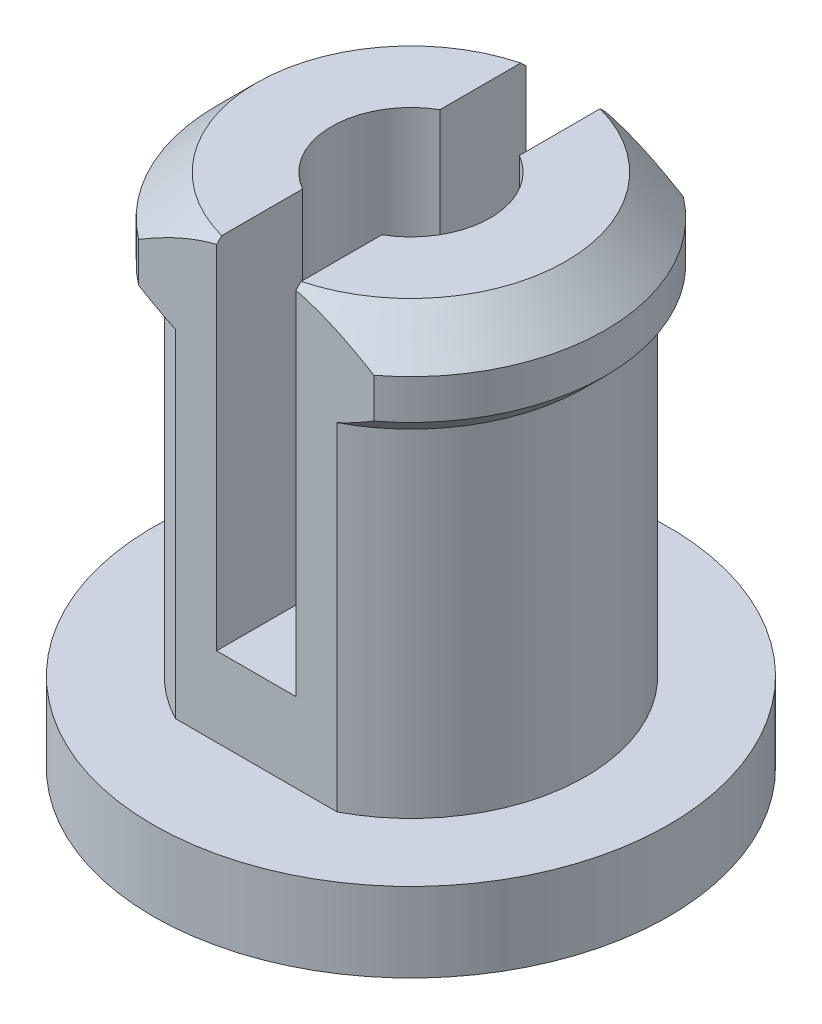
ISO-10303-21;
HEADER;
FILE_DESCRIPTION(('STEP AP214'),'2;1');
FILE_NAME('part.step','',(''),(''),'','','');
FILE_SCHEMA(('AUTOMOTIVE_DESIGN { 1 0 10303 214 1 1 1 1 }'));
ENDSEC;
DATA;
#1=APPLICATION_CONTEXT('core data for automotive mechanical design processes');
#2=APPLICATION_PROTOCOL_DEFINITION('international standard','automotive_design',2000,#1);
#3=PRODUCT_CONTEXT('',#1,'mechanical');
#4=PRODUCT('Part','Part','',(#3));
#5=PRODUCT_RELATED_PRODUCT_CATEGORY('part','',(#4));
#6=PRODUCT_DEFINITION_FORMATION('','',#4);
#7=PRODUCT_DEFINITION_CONTEXT('part definition',#1,'design');
#8=PRODUCT_DEFINITION('design','',#6,#7);
#9=PRODUCT_DEFINITION_SHAPE('','',#8);
#10=(LENGTH_UNIT() NAMED_UNIT(*) SI_UNIT(.MILLI.,.METRE.));
#11=(NAMED_UNIT(*) PLANE_ANGLE_UNIT() SI_UNIT($,.RADIAN.));
#12=(NAMED_UNIT(*) SI_UNIT($,.STERADIAN.) SOLID_ANGLE_UNIT());
#13=UNCERTAINTY_MEASURE_WITH_UNIT(LENGTH_MEASURE(1.E-05),#10,'distance_accuracy_value','');
#14=(GEOMETRIC_REPRESENTATION_CONTEXT(3) GLOBAL_UNCERTAINTY_ASSIGNED_CONTEXT((#13)) GLOBAL_UNIT_ASSIGNED_CONTEXT((#10,
#11,#12)) REPRESENTATION_CONTEXT('',''));
#15=CARTESIAN_POINT('',(0.,0.,0.));
#16=DIRECTION('',(0.,0.,1.));
#17=DIRECTION('',(1.,0.,0.));
#18=AXIS2_PLACEMENT_3D('',#15,#16,#17);
#19=CARTESIAN_POINT('',(0.,11.,0.));
#20=DIRECTION('',(0.,1.,0.));
#21=DIRECTION('',(0.,0.,1.));
#22=AXIS2_PLACEMENT_3D('',#19,#20,#21);
#23=PLANE('',#22);
#24=DIRECTION('',(0.,0.,1.));
#25=VECTOR('',#24,1.);
#26=CARTESIAN_POINT('',(1.,11.,0.));
#27=LINE('',#26,#25);
#28=CARTESIAN_POINT('',(1.,11.,1.73205080756888));
#29=VERTEX_POINT('',#28);
#30=CARTESIAN_POINT('',(1.,11.,3.76961536499416));
#31=VERTEX_POINT('',#30);
#32=EDGE_CURVE('E294',#29,#31,#27,.T.);
#33=ORIENTED_EDGE('',*,*,#32,.T.);
#34=CARTESIAN_POINT('',(0.,11.,0.));
#35=DIRECTION('',(0.,1.,0.));
#36=DIRECTION('',(0.,0.,1.));
#37=AXIS2_PLACEMENT_3D('',#34,#35,#36);
#38=CIRCLE('',#37,3.9);
#39=CARTESIAN_POINT('',(1.,11.,-3.76961536499416));
#40=VERTEX_POINT('',#39);
#41=EDGE_CURVE('E199',#31,#40,#38,.T.);
#42=ORIENTED_EDGE('',*,*,#41,.T.);
#43=DIRECTION('',(0.,0.,1.));
#44=VECTOR('',#43,1.);
#45=CARTESIAN_POINT('',(1.,11.,0.));
#46=LINE('',#45,#44);
#47=CARTESIAN_POINT('',(1.,11.,-1.73205080756888));
#48=VERTEX_POINT('',#47);
#49=EDGE_CURVE('E138',#40,#48,#46,.T.);
#50=ORIENTED_EDGE('',*,*,#49,.T.);
#51=CARTESIAN_POINT('',(0.,11.,0.));
#52=DIRECTION('',(0.,1.,0.));
#53=DIRECTION('',(0.,0.,1.));
#54=AXIS2_PLACEMENT_3D('',#51,#52,#53);
#55=CIRCLE('',#54,2.);
#56=EDGE_CURVE('E299',#29,#48,#55,.T.);
#57=ORIENTED_EDGE('',*,*,#56,.F.);
#58=EDGE_LOOP('',(#33,#42,#50,#57));
#59=FACE_BOUND('',#58,.T.);
#60=ADVANCED_FACE('F45',(#59),#23,.T.);
#61=CARTESIAN_POINT('',(0.,-6.01664358259654,3.9));
#62=DIRECTION('',(0.,0.,1.));
#63=DIRECTION('',(1.,0.,0.));
#64=AXIS2_PLACEMENT_3D('',#61,#62,#63);
#65=PLANE('',#64);
#66=CARTESIAN_POINT('',(-2.96647939483827,9.00000000000002,3.9));
#67=CARTESIAN_POINT('',(-2.89118910821412,8.95442569472736,3.9));
#68=CARTESIAN_POINT('',(-2.81541232557426,8.90964276426273,3.9));
#69=CARTESIAN_POINT('',(-2.66285574367853,8.82195841606904,3.9));
#70=CARTESIAN_POINT('',(-2.5860767502808,8.77905559458639,3.9));
#71=CARTESIAN_POINT('',(-2.43136156920744,8.69535475268988,3.9));
#72=CARTESIAN_POINT('',(-2.35342523312827,8.65455700525932,3.9));
#73=CARTESIAN_POINT('',(-2.19626365456138,8.57537483267373,3.9));
#74=CARTESIAN_POINT('',(-2.11703747641008,8.53699226755765,3.9));
#75=CARTESIAN_POINT('',(-2.03715487874633,8.50000000000001,3.9));
#76=B_SPLINE_CURVE_WITH_KNOTS('',3,(#66,#67,#68,#69,#70,#71,#72,#73,#74,#75),.UNSPECIFIED.,.F.,
.F.,(4,2,2,2,4),(0.,0.264032287984153,0.527863959398481,0.791729758618769,1.05579634626755),.UNSPECIFIED.);
#77=CARTESIAN_POINT('',(-2.96647939483827,9.00000000000002,3.9));
#78=VERTEX_POINT('',#77);
#79=CARTESIAN_POINT('',(-2.03715487874633,8.50000000000001,3.9));
#80=VERTEX_POINT('',#79);
#81=EDGE_CURVE('E240',#78,#80,#76,.T.);
#82=ORIENTED_EDGE('',*,*,#81,.T.);
#83=DIRECTION('',(0.,-1.,0.));
#84=VECTOR('',#83,1.);
#85=CARTESIAN_POINT('',(-2.03715487874633,8.,3.9));
#86=LINE('',#85,#84);
#87=CARTESIAN_POINT('',(-2.03715487874633,0.,3.9));
#88=VERTEX_POINT('',#87);
#89=EDGE_CURVE('E78',#80,#88,#86,.T.);
#90=ORIENTED_EDGE('',*,*,#89,.T.);
#91=DIRECTION('',(-1.,0.,0.));
#92=VECTOR('',#91,1.);
#93=CARTESIAN_POINT('',(0.,0.,3.9));
#94=LINE('',#93,#92);
#95=CARTESIAN_POINT('',(2.03715487874633,0.,3.9));
#96=VERTEX_POINT('',#95);
#97=EDGE_CURVE('E319',#96,#88,#94,.T.);
#98=ORIENTED_EDGE('',*,*,#97,.F.);
#99=DIRECTION('',(0.,-1.,0.));
#100=VECTOR('',#99,1.);
#101=CARTESIAN_POINT('',(2.03715487874633,8.,3.9));
#102=LINE('',#101,#100);
#103=CARTESIAN_POINT('',(2.03715487874633,8.50000000000001,3.9));
#104=VERTEX_POINT('',#103);
#105=EDGE_CURVE('E90',#96,#104,#102,.F.);
#106=ORIENTED_EDGE('',*,*,#105,.T.);
#107=CARTESIAN_POINT('',(2.03715487874633,8.50000000000001,3.9));
#108=CARTESIAN_POINT('',(2.11703747641008,8.53699226755765,3.9));
#109=CARTESIAN_POINT('',(2.19626365456138,8.57537483267373,3.9));
#110=CARTESIAN_POINT('',(2.35342523312827,8.65455700525932,3.9));
#111=CARTESIAN_POINT('',(2.43136156920744,8.69535475268988,3.9));
#112=CARTESIAN_POINT('',(2.5860767502808,8.77905559458639,3.9));
#113=CARTESIAN_POINT('',(2.66285574367853,8.82195841606904,3.9));
#114=CARTESIAN_POINT('',(2.81541232557426,8.90964276426273,3.9));
#115=CARTESIAN_POINT('',(2.89118910821412,8.95442569472736,3.9));
#116=CARTESIAN_POINT('',(2.96647939483827,9.00000000000002,3.9));
#117=B_SPLINE_CURVE_WITH_KNOTS('',3,(#107,#108,#109,#110,#111,#112,#113,#114,#115,#116),
.UNSPECIFIED.,.F.,.F.,(4,2,2,2,4),(0.,0.264066587648786,0.527932386869073,0.791764058283402,
1.05579634626755),.UNSPECIFIED.);
#118=CARTESIAN_POINT('',(2.96647939483827,9.00000000000002,3.9));
#119=VERTEX_POINT('',#118);
#120=EDGE_CURVE('E228',#104,#119,#117,.T.);
#121=ORIENTED_EDGE('',*,*,#120,.T.);
#122=DIRECTION('',(0.,1.,0.));
#123=VECTOR('',#122,1.);
#124=CARTESIAN_POINT('',(2.96647939483827,-6.01664358259654,3.9));
#125=LINE('',#124,#123);
#126=CARTESIAN_POINT('',(2.96647939483827,9.99999999999999,3.9));
#127=VERTEX_POINT('',#126);
#128=EDGE_CURVE('E313',#119,#127,#125,.T.);
#129=ORIENTED_EDGE('',*,*,#128,.T.);
#130=CARTESIAN_POINT('',(2.96647939483827,9.99999999999999,3.9));
#131=CARTESIAN_POINT('',(2.88936505497642,10.0466793445833,3.9));
#132=CARTESIAN_POINT('',(2.81174380725965,10.0925250390421,3.9));
#133=CARTESIAN_POINT('',(2.65536847672463,10.1822811719095,3.9));
#134=CARTESIAN_POINT('',(2.57661414244571,10.2261911716695,3.9));
#135=CARTESIAN_POINT('',(2.33942832354997,10.3540974764555,3.9));
#136=CARTESIAN_POINT('',(2.17919869577028,10.4348074890939,3.9));
#137=CARTESIAN_POINT('',(1.85293386105664,10.5846405415535,3.9));
#138=CARTESIAN_POINT('',(1.68688886208465,10.6537427784425,3.9));
#139=CARTESIAN_POINT('',(1.34821893538945,10.776557107511,3.9));
#140=CARTESIAN_POINT('',(1.17556258263929,10.8301815841427,3.9));
#141=CARTESIAN_POINT('',(1.,10.8738355721605,3.9));
#142=B_SPLINE_CURVE_WITH_KNOTS('',3,(#130,#131,#132,#133,#134,#135,#136,#137,#138,#139,#140,
#141),.UNSPECIFIED.,.F.,.F.,(4,2,2,2,2,4),(0.,0.270420708533677,0.540902385463847,
1.07878835696163,1.61762825012948,2.15946109661112),.UNSPECIFIED.);
#143=CARTESIAN_POINT('',(1.,10.8738355721605,3.9));
#144=VERTEX_POINT('',#143);
#145=EDGE_CURVE('E219',#127,#144,#142,.T.);
#146=ORIENTED_EDGE('',*,*,#145,.T.);
#147=DIRECTION('',(0.,1.,0.));
#148=VECTOR('',#147,1.);
#149=CARTESIAN_POINT('',(1.,2.,3.9));
#150=LINE('',#149,#148);
#151=CARTESIAN_POINT('',(1.,2.,3.9));
#152=VERTEX_POINT('',#151);
#153=EDGE_CURVE('E357',#152,#144,#150,.T.);
#154=ORIENTED_EDGE('',*,*,#153,.F.);
#155=DIRECTION('',(1.,0.,0.));
#156=VECTOR('',#155,1.);
#157=CARTESIAN_POINT('',(0.,2.,3.9));
#158=LINE('',#157,#156);
#159=CARTESIAN_POINT('',(-1.,2.,3.9));
#160=VERTEX_POINT('',#159);
#161=EDGE_CURVE('E366',#160,#152,#158,.T.);
#162=ORIENTED_EDGE('',*,*,#161,.F.);
#163=DIRECTION('',(0.,1.,0.));
#164=VECTOR('',#163,1.);
#165=CARTESIAN_POINT('',(-1.,2.,3.9));
#166=LINE('',#165,#164);
#167=CARTESIAN_POINT('',(-1.,10.8738355721605,3.9));
#168=VERTEX_POINT('',#167);
#169=EDGE_CURVE('E378',#160,#168,#166,.T.);
#170=ORIENTED_EDGE('',*,*,#169,.T.);
#171=CARTESIAN_POINT('',(-1.,10.8738355721605,3.9));
#172=CARTESIAN_POINT('',(-1.17556258263929,10.8301815841427,3.9));
#173=CARTESIAN_POINT('',(-1.34821893538945,10.776557107511,3.9));
#174=CARTESIAN_POINT('',(-1.68688886208465,10.6537427784425,3.9));
#175=CARTESIAN_POINT('',(-1.85293386105664,10.5846405415535,3.9));
#176=CARTESIAN_POINT('',(-2.17919869577028,10.4348074890939,3.9));
#177=CARTESIAN_POINT('',(-2.33942832354997,10.3540974764555,3.9));
#178=CARTESIAN_POINT('',(-2.57661414244571,10.2261911716695,3.9));
#179=CARTESIAN_POINT('',(-2.65536847672463,10.1822811719095,3.9));
#180=CARTESIAN_POINT('',(-2.81174380725965,10.0925250390421,3.9));
#181=CARTESIAN_POINT('',(-2.88936505497642,10.0466793445833,3.9));
#182=CARTESIAN_POINT('',(-2.96647939483827,9.99999999999999,3.9));
#183=B_SPLINE_CURVE_WITH_KNOTS('',3,(#171,#172,#173,#174,#175,#176,#177,#178,#179,#180,#181,
#182),.UNSPECIFIED.,.F.,.F.,(4,2,2,2,2,4),(0.,0.541832846481641,1.08067273964949,
1.61855871114727,1.88904038807744,2.15946109661112),.UNSPECIFIED.);
#184=CARTESIAN_POINT('',(-2.96647939483827,9.99999999999999,3.9));
#185=VERTEX_POINT('',#184);
#186=EDGE_CURVE('E234',#168,#185,#183,.T.);
#187=ORIENTED_EDGE('',*,*,#186,.T.);
#188=DIRECTION('',(0.,1.,0.));
#189=VECTOR('',#188,1.);
#190=CARTESIAN_POINT('',(-2.96647939483827,-6.01664358259654,3.9));
#191=LINE('',#190,#189);
#192=EDGE_CURVE('E320',#78,#185,#191,.T.);
#193=ORIENTED_EDGE('',*,*,#192,.F.);
#194=EDGE_LOOP('',(#82,#90,#98,#106,#121,#129,#146,#154,#162,#170,#187,#193));
#195=FACE_BOUND('',#194,.T.);
#196=ADVANCED_FACE('F210',(#195),#65,.T.);
#197=CARTESIAN_POINT('',(0.,8.,0.));
#198=DIRECTION('',(0.,-1.,0.));
#199=DIRECTION('',(0.,0.,-1.));
#200=AXIS2_PLACEMENT_3D('',#197,#198,#199);
#201=CYLINDRICAL_SURFACE('',#200,4.4);
#202=ORIENTED_EDGE('',*,*,#89,.F.);
#203=CARTESIAN_POINT('',(0.,8.50000000000001,0.));
#204=DIRECTION('',(0.,1.,0.));
#205=DIRECTION('',(0.,0.,1.));
#206=AXIS2_PLACEMENT_3D('',#203,#204,#205);
#207=CIRCLE('',#206,4.4);
#208=CARTESIAN_POINT('',(-2.03715487874633,8.50000000000001,-3.9));
#209=VERTEX_POINT('',#208);
#210=EDGE_CURVE('E56',#80,#209,#207,.F.);
#211=ORIENTED_EDGE('',*,*,#210,.T.);
#212=DIRECTION('',(0.,-1.,0.));
#213=VECTOR('',#212,1.);
#214=CARTESIAN_POINT('',(-2.03715487874633,8.,-3.9));
#215=LINE('',#214,#213);
#216=CARTESIAN_POINT('',(-2.03715487874633,0.,-3.9));
#217=VERTEX_POINT('',#216);
#218=EDGE_CURVE('E345',#209,#217,#215,.T.);
#219=ORIENTED_EDGE('',*,*,#218,.T.);
#220=CARTESIAN_POINT('',(0.,0.,0.));
#221=DIRECTION('',(0.,1.,0.));
#222=DIRECTION('',(0.,0.,1.));
#223=AXIS2_PLACEMENT_3D('',#220,#221,#222);
#224=CIRCLE('',#223,4.4);
#225=EDGE_CURVE('E340',#217,#88,#224,.T.);
#226=ORIENTED_EDGE('',*,*,#225,.T.);
#227=EDGE_LOOP('',(#202,#211,#219,#226));
#228=FACE_BOUND('',#227,.T.);
#229=ADVANCED_FACE('F213',(#228),#201,.T.);
#230=ORIENTED_EDGE('',*,*,#105,.F.);
#231=CARTESIAN_POINT('',(2.03715487874633,0.,-3.9));
#232=VERTEX_POINT('',#231);
#233=EDGE_CURVE('E331',#96,#232,#224,.T.);
#234=ORIENTED_EDGE('',*,*,#233,.T.);
#235=DIRECTION('',(0.,-1.,0.));
#236=VECTOR('',#235,1.);
#237=CARTESIAN_POINT('',(2.03715487874633,8.,-3.9));
#238=LINE('',#237,#236);
#239=CARTESIAN_POINT('',(2.03715487874633,8.50000000000001,-3.9));
#240=VERTEX_POINT('',#239);
#241=EDGE_CURVE('E348',#232,#240,#238,.F.);
#242=ORIENTED_EDGE('',*,*,#241,.T.);
#243=CARTESIAN_POINT('',(0.,8.50000000000001,0.));
#244=DIRECTION('',(0.,1.,0.));
#245=DIRECTION('',(0.,0.,1.));
#246=AXIS2_PLACEMENT_3D('',#243,#244,#245);
#247=CIRCLE('',#246,4.4);
#248=EDGE_CURVE('E11',#240,#104,#247,.F.);
#249=ORIENTED_EDGE('',*,*,#248,.T.);
#250=EDGE_LOOP('',(#230,#234,#242,#249));
#251=FACE_BOUND('',#250,.T.);
#252=ADVANCED_FACE('F275',(#251),#201,.T.);
#253=CARTESIAN_POINT('',(0.,11.,0.));
#254=DIRECTION('',(0.,-1.,0.));
#255=DIRECTION('',(0.,0.,-1.));
#256=AXIS2_PLACEMENT_3D('',#253,#254,#255);
#257=CYLINDRICAL_SURFACE('',#256,4.9);
#258=DIRECTION('',(0.,1.,0.));
#259=VECTOR('',#258,1.);
#260=CARTESIAN_POINT('',(-2.96647939483827,-6.01664358259654,-3.9));
#261=LINE('',#260,#259);
#262=CARTESIAN_POINT('',(-2.96647939483827,9.00000000000002,-3.9));
#263=VERTEX_POINT('',#262);
#264=CARTESIAN_POINT('',(-2.96647939483827,9.99999999999999,-3.9));
#265=VERTEX_POINT('',#264);
#266=EDGE_CURVE('E354',#263,#265,#261,.T.);
#267=ORIENTED_EDGE('',*,*,#266,.F.);
#268=CARTESIAN_POINT('',(0.,9.00000000000002,0.));
#269=DIRECTION('',(0.,1.,0.));
#270=DIRECTION('',(0.,0.,1.));
#271=AXIS2_PLACEMENT_3D('',#268,#269,#270);
#272=CIRCLE('',#271,4.9);
#273=EDGE_CURVE('E322',#263,#78,#272,.T.);
#274=ORIENTED_EDGE('',*,*,#273,.T.);
#275=ORIENTED_EDGE('',*,*,#192,.T.);
#276=CARTESIAN_POINT('',(0.,9.99999999999999,0.));
#277=DIRECTION('',(0.,1.,0.));
#278=DIRECTION('',(0.,0.,1.));
#279=AXIS2_PLACEMENT_3D('',#276,#277,#278);
#280=CIRCLE('',#279,4.9);
#281=EDGE_CURVE('E324',#185,#265,#280,.F.);
#282=ORIENTED_EDGE('',*,*,#281,.T.);
#283=EDGE_LOOP('',(#267,#274,#275,#282));
#284=FACE_BOUND('',#283,.T.);
#285=ADVANCED_FACE('F276',(#284),#257,.T.);
#286=ORIENTED_EDGE('',*,*,#128,.F.);
#287=CARTESIAN_POINT('',(0.,9.00000000000002,0.));
#288=DIRECTION('',(0.,1.,0.));
#289=DIRECTION('',(0.,0.,1.));
#290=AXIS2_PLACEMENT_3D('',#287,#288,#289);
#291=CIRCLE('',#290,4.9);
#292=CARTESIAN_POINT('',(2.96647939483827,9.00000000000002,-3.9));
#293=VERTEX_POINT('',#292);
#294=EDGE_CURVE('E305',#119,#293,#291,.T.);
#295=ORIENTED_EDGE('',*,*,#294,.T.);
#296=DIRECTION('',(0.,1.,0.));
#297=VECTOR('',#296,1.);
#298=CARTESIAN_POINT('',(2.96647939483827,-6.01664358259654,-3.9));
#299=LINE('',#298,#297);
#300=CARTESIAN_POINT('',(2.96647939483827,9.99999999999999,-3.9));
#301=VERTEX_POINT('',#300);
#302=EDGE_CURVE('E314',#293,#301,#299,.T.);
#303=ORIENTED_EDGE('',*,*,#302,.T.);
#304=CARTESIAN_POINT('',(0.,9.99999999999999,0.));
#305=DIRECTION('',(0.,1.,0.));
#306=DIRECTION('',(0.,0.,1.));
#307=AXIS2_PLACEMENT_3D('',#304,#305,#306);
#308=CIRCLE('',#307,4.9);
#309=EDGE_CURVE('E126',#301,#127,#308,.F.);
#310=ORIENTED_EDGE('',*,*,#309,.T.);
#311=EDGE_LOOP('',(#286,#295,#303,#310));
#312=FACE_BOUND('',#311,.T.);
#313=ADVANCED_FACE('F278',(#312),#257,.T.);
#314=DIRECTION('',(0.,0.,1.));
#315=VECTOR('',#314,1.);
#316=CARTESIAN_POINT('',(-1.,11.,0.));
#317=LINE('',#316,#315);
#318=CARTESIAN_POINT('',(-1.,11.,-3.76961536499416));
#319=VERTEX_POINT('',#318);
#320=CARTESIAN_POINT('',(-1.,11.,-1.73205080756888));
#321=VERTEX_POINT('',#320);
#322=EDGE_CURVE('E118',#319,#321,#317,.T.);
#323=ORIENTED_EDGE('',*,*,#322,.F.);
#324=CARTESIAN_POINT('',(0.,11.,0.));
#325=DIRECTION('',(0.,1.,0.));
#326=DIRECTION('',(0.,0.,1.));
#327=AXIS2_PLACEMENT_3D('',#324,#325,#326);
#328=CIRCLE('',#327,3.9);
#329=CARTESIAN_POINT('',(-1.,11.,3.76961536499416));
#330=VERTEX_POINT('',#329);
#331=EDGE_CURVE('E134',#319,#330,#328,.T.);
#332=ORIENTED_EDGE('',*,*,#331,.T.);
#333=DIRECTION('',(0.,0.,1.));
#334=VECTOR('',#333,1.);
#335=CARTESIAN_POINT('',(-1.,11.,0.));
#336=LINE('',#335,#334);
#337=CARTESIAN_POINT('',(-1.,11.,1.73205080756888));
#338=VERTEX_POINT('',#337);
#339=EDGE_CURVE('E382',#338,#330,#336,.T.);
#340=ORIENTED_EDGE('',*,*,#339,.F.);
#341=CARTESIAN_POINT('',(0.,11.,0.));
#342=DIRECTION('',(0.,1.,0.));
#343=DIRECTION('',(0.,0.,1.));
#344=AXIS2_PLACEMENT_3D('',#341,#342,#343);
#345=CIRCLE('',#344,2.);
#346=EDGE_CURVE('E137',#321,#338,#345,.T.);
#347=ORIENTED_EDGE('',*,*,#346,.F.);
#348=EDGE_LOOP('',(#323,#332,#340,#347));
#349=FACE_BOUND('',#348,.T.);
#350=ADVANCED_FACE('F132',(#349),#23,.T.);
#351=CARTESIAN_POINT('',(0.,-2.,0.));
#352=DIRECTION('',(0.,1.,0.));
#353=DIRECTION('',(0.,0.,1.));
#354=AXIS2_PLACEMENT_3D('',#351,#352,#353);
#355=CYLINDRICAL_SURFACE('',#354,6.5);
#356=CARTESIAN_POINT('',(0.,-2.,0.));
#357=DIRECTION('',(0.,1.,0.));
#358=DIRECTION('',(0.,0.,1.));
#359=AXIS2_PLACEMENT_3D('',#356,#357,#358);
#360=CIRCLE('',#359,6.5);
#361=CARTESIAN_POINT('',(0.,-2.,6.5));
#362=VERTEX_POINT('',#361);
#363=EDGE_CURVE('E337',#362,#362,#360,.T.);
#364=ORIENTED_EDGE('',*,*,#363,.T.);
#365=EDGE_LOOP('',(#364));
#366=FACE_BOUND('',#365,.T.);
#367=CARTESIAN_POINT('',(0.,0.,0.));
#368=DIRECTION('',(0.,1.,0.));
#369=DIRECTION('',(0.,0.,1.));
#370=AXIS2_PLACEMENT_3D('',#367,#368,#369);
#371=CIRCLE('',#370,6.5);
#372=CARTESIAN_POINT('',(0.,0.,6.5));
#373=VERTEX_POINT('',#372);
#374=EDGE_CURVE('E334',#373,#373,#371,.T.);
#375=ORIENTED_EDGE('',*,*,#374,.F.);
#376=EDGE_LOOP('',(#375));
#377=FACE_BOUND('',#376,.T.);
#378=ADVANCED_FACE('F260',(#366,#377),#355,.T.);
#379=CARTESIAN_POINT('',(0.,-2.,0.));
#380=DIRECTION('',(0.,1.,0.));
#381=DIRECTION('',(0.,0.,1.));
#382=AXIS2_PLACEMENT_3D('',#379,#380,#381);
#383=PLANE('',#382);
#384=ORIENTED_EDGE('',*,*,#363,.F.);
#385=EDGE_LOOP('',(#384));
#386=FACE_BOUND('',#385,.T.);
#387=ADVANCED_FACE('F264',(#386),#383,.F.);
#388=CARTESIAN_POINT('',(0.,0.,0.));
#389=DIRECTION('',(0.,1.,0.));
#390=DIRECTION('',(0.,0.,1.));
#391=AXIS2_PLACEMENT_3D('',#388,#389,#390);
#392=PLANE('',#391);
#393=ORIENTED_EDGE('',*,*,#97,.T.);
#394=ORIENTED_EDGE('',*,*,#225,.F.);
#395=DIRECTION('',(-1.,0.,0.));
#396=VECTOR('',#395,1.);
#397=CARTESIAN_POINT('',(0.,0.,-3.9));
#398=LINE('',#397,#396);
#399=EDGE_CURVE('E351',#232,#217,#398,.T.);
#400=ORIENTED_EDGE('',*,*,#399,.F.);
#401=ORIENTED_EDGE('',*,*,#233,.F.);
#402=EDGE_LOOP('',(#393,#394,#400,#401));
#403=FACE_BOUND('',#402,.T.);
#404=ORIENTED_EDGE('',*,*,#374,.T.);
#405=EDGE_LOOP('',(#404));
#406=FACE_BOUND('',#405,.T.);
#407=ADVANCED_FACE('F266',(#403,#406),#392,.T.);
#408=CARTESIAN_POINT('',(0.,-6.01664358259654,-3.9));
#409=DIRECTION('',(0.,0.,1.));
#410=DIRECTION('',(1.,0.,0.));
#411=AXIS2_PLACEMENT_3D('',#408,#409,#410);
#412=PLANE('',#411);
#413=ORIENTED_EDGE('',*,*,#218,.F.);
#414=CARTESIAN_POINT('',(-2.03715487874633,8.50000000000001,-3.9));
#415=CARTESIAN_POINT('',(-2.11703747641008,8.53699226755765,-3.9));
#416=CARTESIAN_POINT('',(-2.19626365456138,8.57537483267373,-3.9));
#417=CARTESIAN_POINT('',(-2.35342523312827,8.65455700525932,-3.9));
#418=CARTESIAN_POINT('',(-2.43136156920744,8.69535475268988,-3.9));
#419=CARTESIAN_POINT('',(-2.5860767502808,8.77905559458639,-3.9));
#420=CARTESIAN_POINT('',(-2.66285574367853,8.82195841606904,-3.9));
#421=CARTESIAN_POINT('',(-2.81541232557426,8.90964276426273,-3.9));
#422=CARTESIAN_POINT('',(-2.89118910821412,8.95442569472736,-3.9));
#423=CARTESIAN_POINT('',(-2.96647939483827,9.00000000000002,-3.9));
#424=B_SPLINE_CURVE_WITH_KNOTS('',3,(#414,#415,#416,#417,#418,#419,#420,#421,#422,#423),
.UNSPECIFIED.,.F.,.F.,(4,2,2,2,4),(0.,0.264066587648786,0.527932386869073,0.791764058283402,
1.05579634626755),.UNSPECIFIED.);
#425=EDGE_CURVE('E143',#209,#263,#424,.T.);
#426=ORIENTED_EDGE('',*,*,#425,.T.);
#427=ORIENTED_EDGE('',*,*,#266,.T.);
#428=CARTESIAN_POINT('',(-2.96647939483827,9.99999999999999,-3.9));
#429=CARTESIAN_POINT('',(-2.88936505497642,10.0466793445833,-3.9));
#430=CARTESIAN_POINT('',(-2.81174380725965,10.0925250390421,-3.9));
#431=CARTESIAN_POINT('',(-2.65536847672463,10.1822811719095,-3.9));
#432=CARTESIAN_POINT('',(-2.57661414244571,10.2261911716695,-3.9));
#433=CARTESIAN_POINT('',(-2.33942832354997,10.3540974764555,-3.9));
#434=CARTESIAN_POINT('',(-2.17919869577028,10.4348074890939,-3.9));
#435=CARTESIAN_POINT('',(-1.85293386105664,10.5846405415535,-3.9));
#436=CARTESIAN_POINT('',(-1.68688886208465,10.6537427784425,-3.9));
#437=CARTESIAN_POINT('',(-1.34821893538945,10.776557107511,-3.9));
#438=CARTESIAN_POINT('',(-1.17556258263929,10.8301815841427,-3.9));
#439=CARTESIAN_POINT('',(-1.,10.8738355721605,-3.9));
#440=B_SPLINE_CURVE_WITH_KNOTS('',3,(#428,#429,#430,#431,#432,#433,#434,#435,#436,#437,#438,
#439),.UNSPECIFIED.,.F.,.F.,(4,2,2,2,2,4),(0.,0.270420708533677,0.540902385463847,
1.07878835696163,1.61762825012948,2.15946109661112),.UNSPECIFIED.);
#441=CARTESIAN_POINT('',(-1.,10.8738355721605,-3.9));
#442=VERTEX_POINT('',#441);
#443=EDGE_CURVE('E147',#265,#442,#440,.T.);
#444=ORIENTED_EDGE('',*,*,#443,.T.);
#445=DIRECTION('',(0.,1.,0.));
#446=VECTOR('',#445,1.);
#447=CARTESIAN_POINT('',(-1.,2.,-3.9));
#448=LINE('',#447,#446);
#449=CARTESIAN_POINT('',(-1.,2.,-3.9));
#450=VERTEX_POINT('',#449);
#451=EDGE_CURVE('E122',#450,#442,#448,.T.);
#452=ORIENTED_EDGE('',*,*,#451,.F.);
#453=DIRECTION('',(-1.,0.,0.));
#454=VECTOR('',#453,1.);
#455=CARTESIAN_POINT('',(0.,2.,-3.9));
#456=LINE('',#455,#454);
#457=CARTESIAN_POINT('',(1.,2.,-3.9));
#458=VERTEX_POINT('',#457);
#459=EDGE_CURVE('E399',#458,#450,#456,.T.);
#460=ORIENTED_EDGE('',*,*,#459,.F.);
#461=DIRECTION('',(0.,1.,0.));
#462=VECTOR('',#461,1.);
#463=CARTESIAN_POINT('',(1.,2.,-3.9));
#464=LINE('',#463,#462);
#465=CARTESIAN_POINT('',(1.,10.8738355721605,-3.9));
#466=VERTEX_POINT('',#465);
#467=EDGE_CURVE('E369',#458,#466,#464,.T.);
#468=ORIENTED_EDGE('',*,*,#467,.T.);
#469=CARTESIAN_POINT('',(1.,10.8738355721605,-3.9));
#470=CARTESIAN_POINT('',(1.17556258263929,10.8301815841427,-3.9));
#471=CARTESIAN_POINT('',(1.34821893538945,10.776557107511,-3.9));
#472=CARTESIAN_POINT('',(1.68688886208465,10.6537427784425,-3.9));
#473=CARTESIAN_POINT('',(1.85293386105664,10.5846405415535,-3.9));
#474=CARTESIAN_POINT('',(2.17919869577028,10.4348074890939,-3.9));
#475=CARTESIAN_POINT('',(2.33942832354997,10.3540974764555,-3.9));
#476=CARTESIAN_POINT('',(2.57661414244571,10.2261911716695,-3.9));
#477=CARTESIAN_POINT('',(2.65536847672463,10.1822811719095,-3.9));
#478=CARTESIAN_POINT('',(2.81174380725965,10.0925250390421,-3.9));
#479=CARTESIAN_POINT('',(2.88936505497642,10.0466793445833,-3.9));
#480=CARTESIAN_POINT('',(2.96647939483827,9.99999999999999,-3.9));
#481=B_SPLINE_CURVE_WITH_KNOTS('',3,(#469,#470,#471,#472,#473,#474,#475,#476,#477,#478,#479,
#480),.UNSPECIFIED.,.F.,.F.,(4,2,2,2,2,4),(0.,0.541832846481641,1.08067273964949,
1.61855871114727,1.88904038807744,2.15946109661112),.UNSPECIFIED.);
#482=EDGE_CURVE('E246',#466,#301,#481,.T.);
#483=ORIENTED_EDGE('',*,*,#482,.T.);
#484=ORIENTED_EDGE('',*,*,#302,.F.);
#485=CARTESIAN_POINT('',(2.96647939483827,9.00000000000002,-3.9));
#486=CARTESIAN_POINT('',(2.89118910821412,8.95442569472736,-3.9));
#487=CARTESIAN_POINT('',(2.81541232557426,8.90964276426273,-3.9));
#488=CARTESIAN_POINT('',(2.66285574367853,8.82195841606904,-3.9));
#489=CARTESIAN_POINT('',(2.5860767502808,8.77905559458639,-3.9));
#490=CARTESIAN_POINT('',(2.43136156920744,8.69535475268988,-3.9));
#491=CARTESIAN_POINT('',(2.35342523312827,8.65455700525932,-3.9));
#492=CARTESIAN_POINT('',(2.19626365456138,8.57537483267373,-3.9));
#493=CARTESIAN_POINT('',(2.11703747641008,8.53699226755765,-3.9));
#494=CARTESIAN_POINT('',(2.03715487874633,8.50000000000001,-3.9));
#495=B_SPLINE_CURVE_WITH_KNOTS('',3,(#485,#486,#487,#488,#489,#490,#491,#492,#493,#494),
.UNSPECIFIED.,.F.,.F.,(4,2,2,2,4),(0.,0.264032287984153,0.527863959398481,0.791729758618769,
1.05579634626755),.UNSPECIFIED.);
#496=EDGE_CURVE('E460',#293,#240,#495,.T.);
#497=ORIENTED_EDGE('',*,*,#496,.T.);
#498=ORIENTED_EDGE('',*,*,#241,.F.);
#499=ORIENTED_EDGE('',*,*,#399,.T.);
#500=EDGE_LOOP('',(#413,#426,#427,#444,#452,#460,#468,#483,#484,#497,#498,#499));
#501=FACE_BOUND('',#500,.T.);
#502=ADVANCED_FACE('F208',(#501),#412,.F.);
#503=CARTESIAN_POINT('',(1.,2.,0.));
#504=DIRECTION('',(-1.,0.,0.));
#505=DIRECTION('',(0.,0.,1.));
#506=AXIS2_PLACEMENT_3D('',#503,#504,#505);
#507=PLANE('',#506);
#508=ORIENTED_EDGE('',*,*,#153,.T.);
#509=CARTESIAN_POINT('',(1.,10.8738355721605,3.9));
#510=CARTESIAN_POINT('',(1.,10.8948747342599,3.8782806044495));
#511=CARTESIAN_POINT('',(1.,10.9159080176173,3.85655552043642));
#512=CARTESIAN_POINT('',(1.,10.9579628268971,3.8130939754345));
#513=CARTESIAN_POINT('',(1.,10.9789843528196,3.79135751444563));
#514=CARTESIAN_POINT('',(1.,11.,3.76961536499416));
#515=B_SPLINE_CURVE_WITH_KNOTS('',3,(#509,#510,#511,#512,#513,#514),.UNSPECIFIED.,.F.,.F.,(4,2,
4),(0.,0.0907160655975995,0.181432131406553),.UNSPECIFIED.);
#516=EDGE_CURVE('E198',#144,#31,#515,.T.);
#517=ORIENTED_EDGE('',*,*,#516,.T.);
#518=ORIENTED_EDGE('',*,*,#32,.F.);
#519=DIRECTION('',(0.,1.,0.));
#520=VECTOR('',#519,1.);
#521=CARTESIAN_POINT('',(1.,2.,1.73205080756888));
#522=LINE('',#521,#520);
#523=CARTESIAN_POINT('',(1.,2.,1.73205080756888));
#524=VERTEX_POINT('',#523);
#525=EDGE_CURVE('E362',#524,#29,#522,.T.);
#526=ORIENTED_EDGE('',*,*,#525,.F.);
#527=DIRECTION('',(0.,0.,1.));
#528=VECTOR('',#527,1.);
#529=CARTESIAN_POINT('',(1.,2.,0.));
#530=LINE('',#529,#528);
#531=EDGE_CURVE('E384',#524,#152,#530,.T.);
#532=ORIENTED_EDGE('',*,*,#531,.T.);
#533=EDGE_LOOP('',(#508,#517,#518,#526,#532));
#534=FACE_BOUND('',#533,.T.);
#535=ADVANCED_FACE('F176',(#534),#507,.T.);
#536=CARTESIAN_POINT('',(-1.,2.,0.));
#537=DIRECTION('',(-1.,0.,0.));
#538=DIRECTION('',(0.,0.,1.));
#539=AXIS2_PLACEMENT_3D('',#536,#537,#538);
#540=PLANE('',#539);
#541=ORIENTED_EDGE('',*,*,#339,.T.);
#542=CARTESIAN_POINT('',(-1.,11.,3.76961536499416));
#543=CARTESIAN_POINT('',(-1.,10.9789843528196,3.79135751444563));
#544=CARTESIAN_POINT('',(-1.,10.9579628268971,3.8130939754345));
#545=CARTESIAN_POINT('',(-1.,10.9159080176173,3.85655552043642));
#546=CARTESIAN_POINT('',(-1.,10.8948747342599,3.8782806044495));
#547=CARTESIAN_POINT('',(-1.,10.8738355721605,3.9));
#548=B_SPLINE_CURVE_WITH_KNOTS('',3,(#542,#543,#544,#545,#546,#547),.UNSPECIFIED.,.F.,.F.,(4,2,
4),(0.,0.0907160658089546,0.181432131406553),.UNSPECIFIED.);
#549=EDGE_CURVE('E127',#330,#168,#548,.T.);
#550=ORIENTED_EDGE('',*,*,#549,.T.);
#551=ORIENTED_EDGE('',*,*,#169,.F.);
#552=DIRECTION('',(0.,0.,1.));
#553=VECTOR('',#552,1.);
#554=CARTESIAN_POINT('',(-1.,2.,0.));
#555=LINE('',#554,#553);
#556=CARTESIAN_POINT('',(-1.,2.,1.73205080756888));
#557=VERTEX_POINT('',#556);
#558=EDGE_CURVE('E390',#557,#160,#555,.T.);
#559=ORIENTED_EDGE('',*,*,#558,.F.);
#560=DIRECTION('',(0.,1.,0.));
#561=VECTOR('',#560,1.);
#562=CARTESIAN_POINT('',(-1.,2.,1.73205080756888));
#563=LINE('',#562,#561);
#564=EDGE_CURVE('E375',#557,#338,#563,.T.);
#565=ORIENTED_EDGE('',*,*,#564,.T.);
#566=EDGE_LOOP('',(#541,#550,#551,#559,#565));
#567=FACE_BOUND('',#566,.T.);
#568=ADVANCED_FACE('F170',(#567),#540,.F.);
#569=CARTESIAN_POINT('',(0.,2.,0.));
#570=DIRECTION('',(0.,1.,0.));
#571=DIRECTION('',(0.,0.,1.));
#572=AXIS2_PLACEMENT_3D('',#569,#570,#571);
#573=CYLINDRICAL_SURFACE('',#572,2.);
#574=ORIENTED_EDGE('',*,*,#346,.T.);
#575=ORIENTED_EDGE('',*,*,#564,.F.);
#576=CARTESIAN_POINT('',(0.,2.,0.));
#577=DIRECTION('',(0.,1.,0.));
#578=DIRECTION('',(0.,0.,1.));
#579=AXIS2_PLACEMENT_3D('',#576,#577,#578);
#580=CIRCLE('',#579,2.);
#581=CARTESIAN_POINT('',(-1.,2.,-1.73205080756888));
#582=VERTEX_POINT('',#581);
#583=EDGE_CURVE('E393',#582,#557,#580,.T.);
#584=ORIENTED_EDGE('',*,*,#583,.F.);
#585=DIRECTION('',(0.,1.,0.));
#586=VECTOR('',#585,1.);
#587=CARTESIAN_POINT('',(-1.,2.,-1.73205080756888));
#588=LINE('',#587,#586);
#589=EDGE_CURVE('E373',#582,#321,#588,.T.);
#590=ORIENTED_EDGE('',*,*,#589,.T.);
#591=EDGE_LOOP('',(#574,#575,#584,#590));
#592=FACE_BOUND('',#591,.T.);
#593=ADVANCED_FACE('F175',(#592),#573,.F.);
#594=CARTESIAN_POINT('',(-1.,2.,0.));
#595=DIRECTION('',(-1.,0.,0.));
#596=DIRECTION('',(0.,0.,1.));
#597=AXIS2_PLACEMENT_3D('',#594,#595,#596);
#598=PLANE('',#597);
#599=ORIENTED_EDGE('',*,*,#451,.T.);
#600=CARTESIAN_POINT('',(-1.,10.8738355721605,-3.9));
#601=CARTESIAN_POINT('',(-1.,10.8948747342599,-3.8782806044495));
#602=CARTESIAN_POINT('',(-1.,10.9159080176173,-3.85655552043642));
#603=CARTESIAN_POINT('',(-1.,10.9579628268971,-3.8130939754345));
#604=CARTESIAN_POINT('',(-1.,10.9789843528196,-3.79135751444563));
#605=CARTESIAN_POINT('',(-1.,11.,-3.76961536499416));
#606=B_SPLINE_CURVE_WITH_KNOTS('',3,(#600,#601,#602,#603,#604,#605),.UNSPECIFIED.,.F.,.F.,(4,2,
4),(0.,0.0907160655975995,0.181432131406553),.UNSPECIFIED.);
#607=EDGE_CURVE('E113',#442,#319,#606,.T.);
#608=ORIENTED_EDGE('',*,*,#607,.T.);
#609=ORIENTED_EDGE('',*,*,#322,.T.);
#610=ORIENTED_EDGE('',*,*,#589,.F.);
#611=DIRECTION('',(0.,0.,1.));
#612=VECTOR('',#611,1.);
#613=CARTESIAN_POINT('',(-1.,2.,0.));
#614=LINE('',#613,#612);
#615=EDGE_CURVE('E396',#450,#582,#614,.T.);
#616=ORIENTED_EDGE('',*,*,#615,.F.);
#617=EDGE_LOOP('',(#599,#608,#609,#610,#616));
#618=FACE_BOUND('',#617,.T.);
#619=ADVANCED_FACE('F115',(#618),#598,.F.);
#620=CARTESIAN_POINT('',(1.,2.,0.));
#621=DIRECTION('',(-1.,0.,0.));
#622=DIRECTION('',(0.,0.,1.));
#623=AXIS2_PLACEMENT_3D('',#620,#621,#622);
#624=PLANE('',#623);
#625=ORIENTED_EDGE('',*,*,#49,.F.);
#626=CARTESIAN_POINT('',(1.,11.,-3.76961536499416));
#627=CARTESIAN_POINT('',(1.,10.9789843528196,-3.79135751444563));
#628=CARTESIAN_POINT('',(1.,10.9579628268971,-3.8130939754345));
#629=CARTESIAN_POINT('',(1.,10.9159080176173,-3.85655552043642));
#630=CARTESIAN_POINT('',(1.,10.8948747342599,-3.8782806044495));
#631=CARTESIAN_POINT('',(1.,10.8738355721605,-3.9));
#632=B_SPLINE_CURVE_WITH_KNOTS('',3,(#626,#627,#628,#629,#630,#631),.UNSPECIFIED.,.F.,.F.,(4,2,
4),(0.,0.0907160658089546,0.181432131406553),.UNSPECIFIED.);
#633=EDGE_CURVE('E64',#40,#466,#632,.T.);
#634=ORIENTED_EDGE('',*,*,#633,.T.);
#635=ORIENTED_EDGE('',*,*,#467,.F.);
#636=DIRECTION('',(0.,0.,1.));
#637=VECTOR('',#636,1.);
#638=CARTESIAN_POINT('',(1.,2.,0.));
#639=LINE('',#638,#637);
#640=CARTESIAN_POINT('',(1.,2.,-1.73205080756888));
#641=VERTEX_POINT('',#640);
#642=EDGE_CURVE('E402',#458,#641,#639,.T.);
#643=ORIENTED_EDGE('',*,*,#642,.T.);
#644=DIRECTION('',(0.,1.,0.));
#645=VECTOR('',#644,1.);
#646=CARTESIAN_POINT('',(1.,2.,-1.73205080756888));
#647=LINE('',#646,#645);
#648=EDGE_CURVE('E365',#641,#48,#647,.T.);
#649=ORIENTED_EDGE('',*,*,#648,.T.);
#650=EDGE_LOOP('',(#625,#634,#635,#643,#649));
#651=FACE_BOUND('',#650,.T.);
#652=ADVANCED_FACE('F184',(#651),#624,.T.);
#653=CARTESIAN_POINT('',(0.,2.,0.));
#654=DIRECTION('',(0.,1.,0.));
#655=DIRECTION('',(0.,0.,1.));
#656=AXIS2_PLACEMENT_3D('',#653,#654,#655);
#657=CYLINDRICAL_SURFACE('',#656,2.);
#658=ORIENTED_EDGE('',*,*,#56,.T.);
#659=ORIENTED_EDGE('',*,*,#648,.F.);
#660=CARTESIAN_POINT('',(0.,2.,0.));
#661=DIRECTION('',(0.,1.,0.));
#662=DIRECTION('',(0.,0.,1.));
#663=AXIS2_PLACEMENT_3D('',#660,#661,#662);
#664=CIRCLE('',#663,2.);
#665=EDGE_CURVE('E405',#524,#641,#664,.T.);
#666=ORIENTED_EDGE('',*,*,#665,.F.);
#667=ORIENTED_EDGE('',*,*,#525,.T.);
#668=EDGE_LOOP('',(#658,#659,#666,#667));
#669=FACE_BOUND('',#668,.T.);
#670=ADVANCED_FACE('F188',(#669),#657,.F.);
#671=CARTESIAN_POINT('',(0.,2.,0.));
#672=DIRECTION('',(0.,1.,0.));
#673=DIRECTION('',(0.,0.,1.));
#674=AXIS2_PLACEMENT_3D('',#671,#672,#673);
#675=PLANE('',#674);
#676=ORIENTED_EDGE('',*,*,#531,.F.);
#677=ORIENTED_EDGE('',*,*,#665,.T.);
#678=ORIENTED_EDGE('',*,*,#642,.F.);
#679=ORIENTED_EDGE('',*,*,#459,.T.);
#680=ORIENTED_EDGE('',*,*,#615,.T.);
#681=ORIENTED_EDGE('',*,*,#583,.T.);
#682=ORIENTED_EDGE('',*,*,#558,.T.);
#683=ORIENTED_EDGE('',*,*,#161,.T.);
#684=EDGE_LOOP('',(#676,#677,#678,#679,#680,#681,#682,#683));
#685=FACE_BOUND('',#684,.T.);
#686=ADVANCED_FACE('F178',(#685),#675,.T.);
#687=CARTESIAN_POINT('',(0.,9.00000000000002,0.));
#688=DIRECTION('',(0.,1.,0.));
#689=DIRECTION('',(0.,0.,1.));
#690=AXIS2_PLACEMENT_3D('',#687,#688,#689);
#691=CONICAL_SURFACE('',#690,4.9,0.785398163397443);
#692=ORIENTED_EDGE('',*,*,#425,.F.);
#693=ORIENTED_EDGE('',*,*,#210,.F.);
#694=ORIENTED_EDGE('',*,*,#81,.F.);
#695=ORIENTED_EDGE('',*,*,#273,.F.);
#696=EDGE_LOOP('',(#692,#693,#694,#695));
#697=FACE_BOUND('',#696,.T.);
#698=ADVANCED_FACE('F253',(#697),#691,.T.);
#699=CARTESIAN_POINT('',(0.,11.,0.));
#700=DIRECTION('',(0.,-1.,0.));
#701=DIRECTION('',(0.,0.,-1.));
#702=AXIS2_PLACEMENT_3D('',#699,#700,#701);
#703=CONICAL_SURFACE('',#702,3.9,0.785398163397445);
#704=ORIENTED_EDGE('',*,*,#443,.F.);
#705=ORIENTED_EDGE('',*,*,#281,.F.);
#706=ORIENTED_EDGE('',*,*,#186,.F.);
#707=ORIENTED_EDGE('',*,*,#549,.F.);
#708=ORIENTED_EDGE('',*,*,#331,.F.);
#709=ORIENTED_EDGE('',*,*,#607,.F.);
#710=EDGE_LOOP('',(#704,#705,#706,#707,#708,#709));
#711=FACE_BOUND('',#710,.T.);
#712=ADVANCED_FACE('F140',(#711),#703,.T.);
#713=CARTESIAN_POINT('',(0.,9.00000000000002,0.));
#714=DIRECTION('',(0.,1.,0.));
#715=DIRECTION('',(0.,0.,1.));
#716=AXIS2_PLACEMENT_3D('',#713,#714,#715);
#717=CONICAL_SURFACE('',#716,4.9,0.785398163397443);
#718=ORIENTED_EDGE('',*,*,#120,.F.);
#719=ORIENTED_EDGE('',*,*,#248,.F.);
#720=ORIENTED_EDGE('',*,*,#496,.F.);
#721=ORIENTED_EDGE('',*,*,#294,.F.);
#722=EDGE_LOOP('',(#718,#719,#720,#721));
#723=FACE_BOUND('',#722,.T.);
#724=ADVANCED_FACE('F470',(#723),#717,.T.);
#725=CARTESIAN_POINT('',(0.,11.,0.));
#726=DIRECTION('',(0.,-1.,0.));
#727=DIRECTION('',(0.,0.,-1.));
#728=AXIS2_PLACEMENT_3D('',#725,#726,#727);
#729=CONICAL_SURFACE('',#728,3.9,0.785398163397445);
#730=ORIENTED_EDGE('',*,*,#145,.F.);
#731=ORIENTED_EDGE('',*,*,#309,.F.);
#732=ORIENTED_EDGE('',*,*,#482,.F.);
#733=ORIENTED_EDGE('',*,*,#633,.F.);
#734=ORIENTED_EDGE('',*,*,#41,.F.);
#735=ORIENTED_EDGE('',*,*,#516,.F.);
#736=EDGE_LOOP('',(#730,#731,#732,#733,#734,#735));
#737=FACE_BOUND('',#736,.T.);
#738=ADVANCED_FACE('F48',(#737),#729,.T.);
#739=CLOSED_SHELL('',(#60,#196,#229,#252,#285,#313,#350,#378,#387,#407,#502,#535,#568,#593,#619,
#652,#670,#686,#698,#712,#724,#738));
#740=MANIFOLD_SOLID_BREP('B2',#739);
#741=ADVANCED_BREP_SHAPE_REPRESENTATION('',(#18,#740),#14);
#742=SHAPE_DEFINITION_REPRESENTATION(#9,#741);
ENDSEC;
END-ISO-10303-21;
